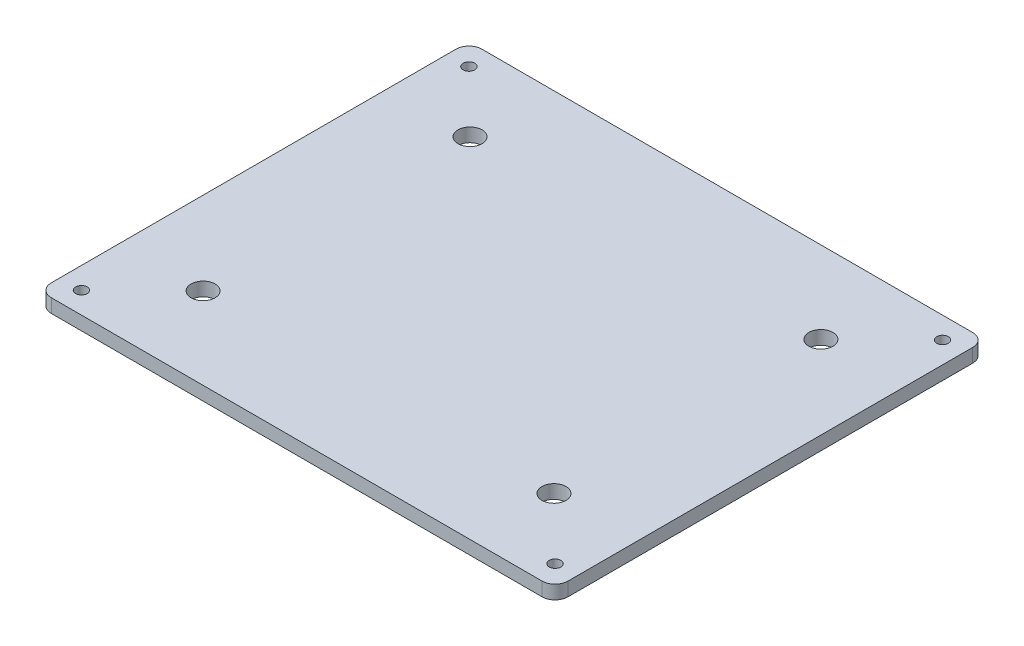
ISO-10303-21;
HEADER;
FILE_DESCRIPTION(('STEP AP214'),'2;1');
FILE_NAME('part.step','',(''),(''),'','','');
FILE_SCHEMA(('AUTOMOTIVE_DESIGN { 1 0 10303 214 1 1 1 1 }'));
ENDSEC;
DATA;
#1=APPLICATION_CONTEXT('core data for automotive mechanical design processes');
#2=APPLICATION_PROTOCOL_DEFINITION('international standard','automotive_design',2000,#1);
#3=PRODUCT_CONTEXT('',#1,'mechanical');
#4=PRODUCT('Part','Part','',(#3));
#5=PRODUCT_RELATED_PRODUCT_CATEGORY('part','',(#4));
#6=PRODUCT_DEFINITION_FORMATION('','',#4);
#7=PRODUCT_DEFINITION_CONTEXT('part definition',#1,'design');
#8=PRODUCT_DEFINITION('design','',#6,#7);
#9=PRODUCT_DEFINITION_SHAPE('','',#8);
#10=(LENGTH_UNIT() NAMED_UNIT(*) SI_UNIT(.MILLI.,.METRE.));
#11=(NAMED_UNIT(*) PLANE_ANGLE_UNIT() SI_UNIT($,.RADIAN.));
#12=(NAMED_UNIT(*) SI_UNIT($,.STERADIAN.) SOLID_ANGLE_UNIT());
#13=UNCERTAINTY_MEASURE_WITH_UNIT(LENGTH_MEASURE(1.E-05),#10,'distance_accuracy_value','');
#14=(GEOMETRIC_REPRESENTATION_CONTEXT(3) GLOBAL_UNCERTAINTY_ASSIGNED_CONTEXT((#13)) GLOBAL_UNIT_ASSIGNED_CONTEXT((#10,
#11,#12)) REPRESENTATION_CONTEXT('',''));
#15=CARTESIAN_POINT('',(0.,0.,0.));
#16=DIRECTION('',(0.,0.,1.));
#17=DIRECTION('',(1.,0.,0.));
#18=AXIS2_PLACEMENT_3D('',#15,#16,#17);
#19=CARTESIAN_POINT('',(-60.,3.175,50.));
#20=DIRECTION('',(1.,0.,0.));
#21=DIRECTION('',(0.,0.,-1.));
#22=AXIS2_PLACEMENT_3D('',#19,#20,#21);
#23=PLANE('',#22);
#24=DIRECTION('',(0.,0.,1.));
#25=VECTOR('',#24,1.);
#26=CARTESIAN_POINT('',(-60.,0.,50.));
#27=LINE('',#26,#25);
#28=CARTESIAN_POINT('',(-60.,0.,-47.));
#29=VERTEX_POINT('',#28);
#30=CARTESIAN_POINT('',(-60.,0.,47.));
#31=VERTEX_POINT('',#30);
#32=EDGE_CURVE('E163',#29,#31,#27,.T.);
#33=ORIENTED_EDGE('',*,*,#32,.T.);
#34=DIRECTION('',(0.,-1.,0.));
#35=VECTOR('',#34,1.);
#36=CARTESIAN_POINT('',(-60.,3.175,47.));
#37=LINE('',#36,#35);
#38=CARTESIAN_POINT('',(-60.,3.175,47.));
#39=VERTEX_POINT('',#38);
#40=EDGE_CURVE('E11',#31,#39,#37,.F.);
#41=ORIENTED_EDGE('',*,*,#40,.T.);
#42=DIRECTION('',(0.,0.,1.));
#43=VECTOR('',#42,1.);
#44=CARTESIAN_POINT('',(-60.,3.175,50.));
#45=LINE('',#44,#43);
#46=CARTESIAN_POINT('',(-60.,3.175,-47.));
#47=VERTEX_POINT('',#46);
#48=EDGE_CURVE('E131',#47,#39,#45,.T.);
#49=ORIENTED_EDGE('',*,*,#48,.F.);
#50=DIRECTION('',(0.,-1.,0.));
#51=VECTOR('',#50,1.);
#52=CARTESIAN_POINT('',(-60.,3.175,-47.));
#53=LINE('',#52,#51);
#54=EDGE_CURVE('E47',#47,#29,#53,.T.);
#55=ORIENTED_EDGE('',*,*,#54,.T.);
#56=EDGE_LOOP('',(#33,#41,#49,#55));
#57=FACE_BOUND('',#56,.T.);
#58=ADVANCED_FACE('F39',(#57),#23,.F.);
#59=CARTESIAN_POINT('',(60.,3.175,50.));
#60=DIRECTION('',(0.,0.,-1.));
#61=DIRECTION('',(-1.,0.,0.));
#62=AXIS2_PLACEMENT_3D('',#59,#60,#61);
#63=PLANE('',#62);
#64=DIRECTION('',(1.,0.,0.));
#65=VECTOR('',#64,1.);
#66=CARTESIAN_POINT('',(60.,0.,50.));
#67=LINE('',#66,#65);
#68=CARTESIAN_POINT('',(-57.,0.,50.));
#69=VERTEX_POINT('',#68);
#70=CARTESIAN_POINT('',(57.,0.,50.));
#71=VERTEX_POINT('',#70);
#72=EDGE_CURVE('E136',#69,#71,#67,.T.);
#73=ORIENTED_EDGE('',*,*,#72,.T.);
#74=DIRECTION('',(0.,-1.,0.));
#75=VECTOR('',#74,1.);
#76=CARTESIAN_POINT('',(57.,3.175,50.));
#77=LINE('',#76,#75);
#78=CARTESIAN_POINT('',(57.,3.175,50.));
#79=VERTEX_POINT('',#78);
#80=EDGE_CURVE('E54',#71,#79,#77,.F.);
#81=ORIENTED_EDGE('',*,*,#80,.T.);
#82=DIRECTION('',(1.,0.,0.));
#83=VECTOR('',#82,1.);
#84=CARTESIAN_POINT('',(60.,3.175,50.));
#85=LINE('',#84,#83);
#86=CARTESIAN_POINT('',(-57.,3.175,50.));
#87=VERTEX_POINT('',#86);
#88=EDGE_CURVE('E134',#87,#79,#85,.T.);
#89=ORIENTED_EDGE('',*,*,#88,.F.);
#90=DIRECTION('',(0.,-1.,0.));
#91=VECTOR('',#90,1.);
#92=CARTESIAN_POINT('',(-57.,3.175,50.));
#93=LINE('',#92,#91);
#94=EDGE_CURVE('E155',#87,#69,#93,.T.);
#95=ORIENTED_EDGE('',*,*,#94,.T.);
#96=EDGE_LOOP('',(#73,#81,#89,#95));
#97=FACE_BOUND('',#96,.T.);
#98=ADVANCED_FACE('F250',(#97),#63,.F.);
#99=CARTESIAN_POINT('',(60.,3.175,50.));
#100=DIRECTION('',(-1.,0.,0.));
#101=DIRECTION('',(0.,0.,1.));
#102=AXIS2_PLACEMENT_3D('',#99,#100,#101);
#103=PLANE('',#102);
#104=DIRECTION('',(0.,0.,-1.));
#105=VECTOR('',#104,1.);
#106=CARTESIAN_POINT('',(60.,0.,50.));
#107=LINE('',#106,#105);
#108=CARTESIAN_POINT('',(60.,0.,47.));
#109=VERTEX_POINT('',#108);
#110=CARTESIAN_POINT('',(60.,0.,-47.));
#111=VERTEX_POINT('',#110);
#112=EDGE_CURVE('E132',#109,#111,#107,.T.);
#113=ORIENTED_EDGE('',*,*,#112,.T.);
#114=DIRECTION('',(0.,-1.,0.));
#115=VECTOR('',#114,1.);
#116=CARTESIAN_POINT('',(60.,3.175,-47.));
#117=LINE('',#116,#115);
#118=CARTESIAN_POINT('',(60.,3.175,-47.));
#119=VERTEX_POINT('',#118);
#120=EDGE_CURVE('E110',#111,#119,#117,.F.);
#121=ORIENTED_EDGE('',*,*,#120,.T.);
#122=DIRECTION('',(0.,0.,-1.));
#123=VECTOR('',#122,1.);
#124=CARTESIAN_POINT('',(60.,3.175,50.));
#125=LINE('',#124,#123);
#126=CARTESIAN_POINT('',(60.,3.175,47.));
#127=VERTEX_POINT('',#126);
#128=EDGE_CURVE('E175',#127,#119,#125,.T.);
#129=ORIENTED_EDGE('',*,*,#128,.F.);
#130=DIRECTION('',(0.,-1.,0.));
#131=VECTOR('',#130,1.);
#132=CARTESIAN_POINT('',(60.,3.175,47.));
#133=LINE('',#132,#131);
#134=EDGE_CURVE('E115',#127,#109,#133,.T.);
#135=ORIENTED_EDGE('',*,*,#134,.T.);
#136=EDGE_LOOP('',(#113,#121,#129,#135));
#137=FACE_BOUND('',#136,.T.);
#138=ADVANCED_FACE('F247',(#137),#103,.F.);
#139=CARTESIAN_POINT('',(60.,3.175,-50.));
#140=DIRECTION('',(0.,0.,1.));
#141=DIRECTION('',(1.,0.,0.));
#142=AXIS2_PLACEMENT_3D('',#139,#140,#141);
#143=PLANE('',#142);
#144=DIRECTION('',(-1.,0.,0.));
#145=VECTOR('',#144,1.);
#146=CARTESIAN_POINT('',(60.,3.175,-50.));
#147=LINE('',#146,#145);
#148=CARTESIAN_POINT('',(57.,3.175,-50.));
#149=VERTEX_POINT('',#148);
#150=CARTESIAN_POINT('',(-57.,3.175,-50.));
#151=VERTEX_POINT('',#150);
#152=EDGE_CURVE('E125',#149,#151,#147,.T.);
#153=ORIENTED_EDGE('',*,*,#152,.F.);
#154=DIRECTION('',(0.,-1.,0.));
#155=VECTOR('',#154,1.);
#156=CARTESIAN_POINT('',(57.,3.175,-50.));
#157=LINE('',#156,#155);
#158=CARTESIAN_POINT('',(57.,0.,-50.));
#159=VERTEX_POINT('',#158);
#160=EDGE_CURVE('E109',#149,#159,#157,.T.);
#161=ORIENTED_EDGE('',*,*,#160,.T.);
#162=DIRECTION('',(-1.,0.,0.));
#163=VECTOR('',#162,1.);
#164=CARTESIAN_POINT('',(60.,0.,-50.));
#165=LINE('',#164,#163);
#166=CARTESIAN_POINT('',(-57.,0.,-50.));
#167=VERTEX_POINT('',#166);
#168=EDGE_CURVE('E122',#159,#167,#165,.T.);
#169=ORIENTED_EDGE('',*,*,#168,.T.);
#170=DIRECTION('',(0.,-1.,0.));
#171=VECTOR('',#170,1.);
#172=CARTESIAN_POINT('',(-57.,3.175,-50.));
#173=LINE('',#172,#171);
#174=EDGE_CURVE('E127',#167,#151,#173,.F.);
#175=ORIENTED_EDGE('',*,*,#174,.T.);
#176=EDGE_LOOP('',(#153,#161,#169,#175));
#177=FACE_BOUND('',#176,.T.);
#178=ADVANCED_FACE('F121',(#177),#143,.F.);
#179=CARTESIAN_POINT('',(0.,3.175,0.));
#180=DIRECTION('',(0.,1.,0.));
#181=DIRECTION('',(0.,0.,1.));
#182=AXIS2_PLACEMENT_3D('',#179,#180,#181);
#183=PLANE('',#182);
#184=CARTESIAN_POINT('',(-55.,3.175,-45.));
#185=DIRECTION('',(0.,1.,0.));
#186=DIRECTION('',(0.,0.,1.));
#187=AXIS2_PLACEMENT_3D('',#184,#185,#186);
#188=CIRCLE('',#187,1.35);
#189=CARTESIAN_POINT('',(-55.,3.175,-43.65));
#190=VERTEX_POINT('',#189);
#191=EDGE_CURVE('E220',#190,#190,#188,.T.);
#192=ORIENTED_EDGE('',*,*,#191,.F.);
#193=EDGE_LOOP('',(#192));
#194=FACE_BOUND('',#193,.T.);
#195=CARTESIAN_POINT('',(55.,3.175,-45.));
#196=DIRECTION('',(0.,1.,0.));
#197=DIRECTION('',(0.,0.,1.));
#198=AXIS2_PLACEMENT_3D('',#195,#196,#197);
#199=CIRCLE('',#198,1.35);
#200=CARTESIAN_POINT('',(55.,3.175,-43.65));
#201=VERTEX_POINT('',#200);
#202=EDGE_CURVE('E214',#201,#201,#199,.T.);
#203=ORIENTED_EDGE('',*,*,#202,.F.);
#204=EDGE_LOOP('',(#203));
#205=FACE_BOUND('',#204,.T.);
#206=CARTESIAN_POINT('',(-55.,3.175,45.));
#207=DIRECTION('',(0.,1.,0.));
#208=DIRECTION('',(0.,0.,1.));
#209=AXIS2_PLACEMENT_3D('',#206,#207,#208);
#210=CIRCLE('',#209,1.35);
#211=CARTESIAN_POINT('',(-55.,3.175,46.35));
#212=VERTEX_POINT('',#211);
#213=EDGE_CURVE('E208',#212,#212,#210,.T.);
#214=ORIENTED_EDGE('',*,*,#213,.F.);
#215=EDGE_LOOP('',(#214));
#216=FACE_BOUND('',#215,.T.);
#217=CARTESIAN_POINT('',(55.,3.175,45.));
#218=DIRECTION('',(0.,1.,0.));
#219=DIRECTION('',(0.,0.,1.));
#220=AXIS2_PLACEMENT_3D('',#217,#218,#219);
#221=CIRCLE('',#220,1.35);
#222=CARTESIAN_POINT('',(55.,3.175,46.35));
#223=VERTEX_POINT('',#222);
#224=EDGE_CURVE('E202',#223,#223,#221,.T.);
#225=ORIENTED_EDGE('',*,*,#224,.F.);
#226=EDGE_LOOP('',(#225));
#227=FACE_BOUND('',#226,.T.);
#228=CARTESIAN_POINT('',(40.75,3.175,-31.));
#229=DIRECTION('',(0.,1.,0.));
#230=DIRECTION('',(0.,0.,1.));
#231=AXIS2_PLACEMENT_3D('',#228,#229,#230);
#232=CIRCLE('',#231,2.794);
#233=CARTESIAN_POINT('',(40.75,3.175,-28.206));
#234=VERTEX_POINT('',#233);
#235=EDGE_CURVE('E185',#234,#234,#232,.T.);
#236=ORIENTED_EDGE('',*,*,#235,.F.);
#237=EDGE_LOOP('',(#236));
#238=FACE_BOUND('',#237,.T.);
#239=CARTESIAN_POINT('',(40.75,3.175,31.));
#240=DIRECTION('',(0.,1.,0.));
#241=DIRECTION('',(0.,0.,1.));
#242=AXIS2_PLACEMENT_3D('',#239,#240,#241);
#243=CIRCLE('',#242,2.794);
#244=CARTESIAN_POINT('',(40.75,3.175,33.794));
#245=VERTEX_POINT('',#244);
#246=EDGE_CURVE('E192',#245,#245,#243,.T.);
#247=ORIENTED_EDGE('',*,*,#246,.F.);
#248=EDGE_LOOP('',(#247));
#249=FACE_BOUND('',#248,.T.);
#250=CARTESIAN_POINT('',(-40.75,3.175,31.));
#251=DIRECTION('',(0.,1.,0.));
#252=DIRECTION('',(0.,0.,1.));
#253=AXIS2_PLACEMENT_3D('',#250,#251,#252);
#254=CIRCLE('',#253,2.794);
#255=CARTESIAN_POINT('',(-40.75,3.175,33.794));
#256=VERTEX_POINT('',#255);
#257=EDGE_CURVE('E180',#256,#256,#254,.T.);
#258=ORIENTED_EDGE('',*,*,#257,.F.);
#259=EDGE_LOOP('',(#258));
#260=FACE_BOUND('',#259,.T.);
#261=CARTESIAN_POINT('',(-40.75,3.175,-31.));
#262=DIRECTION('',(0.,1.,0.));
#263=DIRECTION('',(0.,0.,1.));
#264=AXIS2_PLACEMENT_3D('',#261,#262,#263);
#265=CIRCLE('',#264,2.794);
#266=CARTESIAN_POINT('',(-40.75,3.175,-28.206));
#267=VERTEX_POINT('',#266);
#268=EDGE_CURVE('E171',#267,#267,#265,.T.);
#269=ORIENTED_EDGE('',*,*,#268,.F.);
#270=EDGE_LOOP('',(#269));
#271=FACE_BOUND('',#270,.T.);
#272=ORIENTED_EDGE('',*,*,#128,.T.);
#273=CARTESIAN_POINT('',(57.,3.175,-47.));
#274=DIRECTION('',(0.,1.,0.));
#275=DIRECTION('',(0.,0.,1.));
#276=AXIS2_PLACEMENT_3D('',#273,#274,#275);
#277=CIRCLE('',#276,3.);
#278=EDGE_CURVE('E153',#119,#149,#277,.T.);
#279=ORIENTED_EDGE('',*,*,#278,.T.);
#280=ORIENTED_EDGE('',*,*,#152,.T.);
#281=CARTESIAN_POINT('',(-57.,3.175,-47.));
#282=DIRECTION('',(0.,1.,0.));
#283=DIRECTION('',(0.,0.,1.));
#284=AXIS2_PLACEMENT_3D('',#281,#282,#283);
#285=CIRCLE('',#284,3.);
#286=EDGE_CURVE('E148',#151,#47,#285,.T.);
#287=ORIENTED_EDGE('',*,*,#286,.T.);
#288=ORIENTED_EDGE('',*,*,#48,.T.);
#289=CARTESIAN_POINT('',(-57.,3.175,47.));
#290=DIRECTION('',(0.,1.,0.));
#291=DIRECTION('',(0.,0.,1.));
#292=AXIS2_PLACEMENT_3D('',#289,#290,#291);
#293=CIRCLE('',#292,3.);
#294=EDGE_CURVE('E61',#39,#87,#293,.T.);
#295=ORIENTED_EDGE('',*,*,#294,.T.);
#296=ORIENTED_EDGE('',*,*,#88,.T.);
#297=CARTESIAN_POINT('',(57.,3.175,47.));
#298=DIRECTION('',(0.,1.,0.));
#299=DIRECTION('',(0.,0.,1.));
#300=AXIS2_PLACEMENT_3D('',#297,#298,#299);
#301=CIRCLE('',#300,3.);
#302=EDGE_CURVE('E151',#79,#127,#301,.T.);
#303=ORIENTED_EDGE('',*,*,#302,.T.);
#304=EDGE_LOOP('',(#272,#279,#280,#287,#288,#295,#296,#303));
#305=FACE_BOUND('',#304,.T.);
#306=ADVANCED_FACE('F226',(#194,#205,#216,#227,#238,#249,#260,#271,#305),#183,.T.);
#307=CARTESIAN_POINT('',(0.,0.,0.));
#308=DIRECTION('',(0.,1.,0.));
#309=DIRECTION('',(0.,0.,1.));
#310=AXIS2_PLACEMENT_3D('',#307,#308,#309);
#311=PLANE('',#310);
#312=CARTESIAN_POINT('',(-55.,0.,-45.));
#313=DIRECTION('',(0.,1.,0.));
#314=DIRECTION('',(0.,0.,1.));
#315=AXIS2_PLACEMENT_3D('',#312,#313,#314);
#316=CIRCLE('',#315,1.35);
#317=CARTESIAN_POINT('',(-55.,0.,-43.65));
#318=VERTEX_POINT('',#317);
#319=EDGE_CURVE('E217',#318,#318,#316,.T.);
#320=ORIENTED_EDGE('',*,*,#319,.T.);
#321=EDGE_LOOP('',(#320));
#322=FACE_BOUND('',#321,.T.);
#323=CARTESIAN_POINT('',(55.,0.,-45.));
#324=DIRECTION('',(0.,1.,0.));
#325=DIRECTION('',(0.,0.,1.));
#326=AXIS2_PLACEMENT_3D('',#323,#324,#325);
#327=CIRCLE('',#326,1.35);
#328=CARTESIAN_POINT('',(55.,0.,-43.65));
#329=VERTEX_POINT('',#328);
#330=EDGE_CURVE('E211',#329,#329,#327,.T.);
#331=ORIENTED_EDGE('',*,*,#330,.T.);
#332=EDGE_LOOP('',(#331));
#333=FACE_BOUND('',#332,.T.);
#334=CARTESIAN_POINT('',(-55.,0.,45.));
#335=DIRECTION('',(0.,1.,0.));
#336=DIRECTION('',(0.,0.,1.));
#337=AXIS2_PLACEMENT_3D('',#334,#335,#336);
#338=CIRCLE('',#337,1.35);
#339=CARTESIAN_POINT('',(-55.,0.,46.35));
#340=VERTEX_POINT('',#339);
#341=EDGE_CURVE('E205',#340,#340,#338,.T.);
#342=ORIENTED_EDGE('',*,*,#341,.T.);
#343=EDGE_LOOP('',(#342));
#344=FACE_BOUND('',#343,.T.);
#345=CARTESIAN_POINT('',(55.,0.,45.));
#346=DIRECTION('',(0.,1.,0.));
#347=DIRECTION('',(0.,0.,1.));
#348=AXIS2_PLACEMENT_3D('',#345,#346,#347);
#349=CIRCLE('',#348,1.35);
#350=CARTESIAN_POINT('',(55.,0.,46.35));
#351=VERTEX_POINT('',#350);
#352=EDGE_CURVE('E186',#351,#351,#349,.T.);
#353=ORIENTED_EDGE('',*,*,#352,.T.);
#354=EDGE_LOOP('',(#353));
#355=FACE_BOUND('',#354,.T.);
#356=CARTESIAN_POINT('',(40.75,0.,-31.));
#357=DIRECTION('',(0.,1.,0.));
#358=DIRECTION('',(0.,0.,1.));
#359=AXIS2_PLACEMENT_3D('',#356,#357,#358);
#360=CIRCLE('',#359,2.794);
#361=CARTESIAN_POINT('',(40.75,0.,-28.206));
#362=VERTEX_POINT('',#361);
#363=EDGE_CURVE('E182',#362,#362,#360,.T.);
#364=ORIENTED_EDGE('',*,*,#363,.T.);
#365=EDGE_LOOP('',(#364));
#366=FACE_BOUND('',#365,.T.);
#367=CARTESIAN_POINT('',(40.75,0.,31.));
#368=DIRECTION('',(0.,1.,0.));
#369=DIRECTION('',(0.,0.,1.));
#370=AXIS2_PLACEMENT_3D('',#367,#368,#369);
#371=CIRCLE('',#370,2.794);
#372=CARTESIAN_POINT('',(40.75,0.,33.794));
#373=VERTEX_POINT('',#372);
#374=EDGE_CURVE('E189',#373,#373,#371,.T.);
#375=ORIENTED_EDGE('',*,*,#374,.T.);
#376=EDGE_LOOP('',(#375));
#377=FACE_BOUND('',#376,.T.);
#378=CARTESIAN_POINT('',(-40.75,0.,31.));
#379=DIRECTION('',(0.,1.,0.));
#380=DIRECTION('',(0.,0.,1.));
#381=AXIS2_PLACEMENT_3D('',#378,#379,#380);
#382=CIRCLE('',#381,2.794);
#383=CARTESIAN_POINT('',(-40.75,0.,33.794));
#384=VERTEX_POINT('',#383);
#385=EDGE_CURVE('E195',#384,#384,#382,.T.);
#386=ORIENTED_EDGE('',*,*,#385,.T.);
#387=EDGE_LOOP('',(#386));
#388=FACE_BOUND('',#387,.T.);
#389=CARTESIAN_POINT('',(-40.75,0.,-31.));
#390=DIRECTION('',(0.,1.,0.));
#391=DIRECTION('',(0.,0.,1.));
#392=AXIS2_PLACEMENT_3D('',#389,#390,#391);
#393=CIRCLE('',#392,2.794);
#394=CARTESIAN_POINT('',(-40.75,0.,-28.206));
#395=VERTEX_POINT('',#394);
#396=EDGE_CURVE('E168',#395,#395,#393,.T.);
#397=ORIENTED_EDGE('',*,*,#396,.T.);
#398=EDGE_LOOP('',(#397));
#399=FACE_BOUND('',#398,.T.);
#400=ORIENTED_EDGE('',*,*,#168,.F.);
#401=CARTESIAN_POINT('',(57.,0.,-47.));
#402=DIRECTION('',(0.,1.,0.));
#403=DIRECTION('',(0.,0.,1.));
#404=AXIS2_PLACEMENT_3D('',#401,#402,#403);
#405=CIRCLE('',#404,3.);
#406=EDGE_CURVE('E105',#159,#111,#405,.F.);
#407=ORIENTED_EDGE('',*,*,#406,.T.);
#408=ORIENTED_EDGE('',*,*,#112,.F.);
#409=CARTESIAN_POINT('',(57.,0.,47.));
#410=DIRECTION('',(0.,1.,0.));
#411=DIRECTION('',(0.,0.,1.));
#412=AXIS2_PLACEMENT_3D('',#409,#410,#411);
#413=CIRCLE('',#412,3.);
#414=EDGE_CURVE('E116',#109,#71,#413,.F.);
#415=ORIENTED_EDGE('',*,*,#414,.T.);
#416=ORIENTED_EDGE('',*,*,#72,.F.);
#417=CARTESIAN_POINT('',(-57.,0.,47.));
#418=DIRECTION('',(0.,1.,0.));
#419=DIRECTION('',(0.,0.,1.));
#420=AXIS2_PLACEMENT_3D('',#417,#418,#419);
#421=CIRCLE('',#420,3.);
#422=EDGE_CURVE('E142',#69,#31,#421,.F.);
#423=ORIENTED_EDGE('',*,*,#422,.T.);
#424=ORIENTED_EDGE('',*,*,#32,.F.);
#425=CARTESIAN_POINT('',(-57.,0.,-47.));
#426=DIRECTION('',(0.,1.,0.));
#427=DIRECTION('',(0.,0.,1.));
#428=AXIS2_PLACEMENT_3D('',#425,#426,#427);
#429=CIRCLE('',#428,3.);
#430=EDGE_CURVE('E126',#29,#167,#429,.F.);
#431=ORIENTED_EDGE('',*,*,#430,.T.);
#432=EDGE_LOOP('',(#400,#407,#408,#415,#416,#423,#424,#431));
#433=FACE_BOUND('',#432,.T.);
#434=ADVANCED_FACE('F129',(#322,#333,#344,#355,#366,#377,#388,#399,#433),#311,.F.);
#435=CARTESIAN_POINT('',(-40.75,0.,-31.));
#436=DIRECTION('',(0.,1.,0.));
#437=DIRECTION('',(0.,0.,1.));
#438=AXIS2_PLACEMENT_3D('',#435,#436,#437);
#439=CYLINDRICAL_SURFACE('',#438,2.794);
#440=ORIENTED_EDGE('',*,*,#396,.F.);
#441=EDGE_LOOP('',(#440));
#442=FACE_BOUND('',#441,.T.);
#443=ORIENTED_EDGE('',*,*,#268,.T.);
#444=EDGE_LOOP('',(#443));
#445=FACE_BOUND('',#444,.T.);
#446=ADVANCED_FACE('F351',(#442,#445),#439,.F.);
#447=CARTESIAN_POINT('',(-40.75,0.,31.));
#448=DIRECTION('',(0.,1.,0.));
#449=DIRECTION('',(0.,0.,1.));
#450=AXIS2_PLACEMENT_3D('',#447,#448,#449);
#451=CYLINDRICAL_SURFACE('',#450,2.794);
#452=ORIENTED_EDGE('',*,*,#385,.F.);
#453=EDGE_LOOP('',(#452));
#454=FACE_BOUND('',#453,.T.);
#455=ORIENTED_EDGE('',*,*,#257,.T.);
#456=EDGE_LOOP('',(#455));
#457=FACE_BOUND('',#456,.T.);
#458=ADVANCED_FACE('F342',(#454,#457),#451,.F.);
#459=CARTESIAN_POINT('',(40.75,0.,31.));
#460=DIRECTION('',(0.,1.,0.));
#461=DIRECTION('',(0.,0.,1.));
#462=AXIS2_PLACEMENT_3D('',#459,#460,#461);
#463=CYLINDRICAL_SURFACE('',#462,2.794);
#464=ORIENTED_EDGE('',*,*,#374,.F.);
#465=EDGE_LOOP('',(#464));
#466=FACE_BOUND('',#465,.T.);
#467=ORIENTED_EDGE('',*,*,#246,.T.);
#468=EDGE_LOOP('',(#467));
#469=FACE_BOUND('',#468,.T.);
#470=ADVANCED_FACE('F333',(#466,#469),#463,.F.);
#471=CARTESIAN_POINT('',(40.75,0.,-31.));
#472=DIRECTION('',(0.,1.,0.));
#473=DIRECTION('',(0.,0.,1.));
#474=AXIS2_PLACEMENT_3D('',#471,#472,#473);
#475=CYLINDRICAL_SURFACE('',#474,2.794);
#476=ORIENTED_EDGE('',*,*,#363,.F.);
#477=EDGE_LOOP('',(#476));
#478=FACE_BOUND('',#477,.T.);
#479=ORIENTED_EDGE('',*,*,#235,.T.);
#480=EDGE_LOOP('',(#479));
#481=FACE_BOUND('',#480,.T.);
#482=ADVANCED_FACE('F324',(#478,#481),#475,.F.);
#483=CARTESIAN_POINT('',(55.,3.175,45.));
#484=DIRECTION('',(0.,1.,0.));
#485=DIRECTION('',(0.,0.,1.));
#486=AXIS2_PLACEMENT_3D('',#483,#484,#485);
#487=CYLINDRICAL_SURFACE('',#486,1.35);
#488=ORIENTED_EDGE('',*,*,#352,.F.);
#489=EDGE_LOOP('',(#488));
#490=FACE_BOUND('',#489,.T.);
#491=ORIENTED_EDGE('',*,*,#224,.T.);
#492=EDGE_LOOP('',(#491));
#493=FACE_BOUND('',#492,.T.);
#494=ADVANCED_FACE('F315',(#490,#493),#487,.F.);
#495=CARTESIAN_POINT('',(-55.,3.175,45.));
#496=DIRECTION('',(0.,1.,0.));
#497=DIRECTION('',(0.,0.,1.));
#498=AXIS2_PLACEMENT_3D('',#495,#496,#497);
#499=CYLINDRICAL_SURFACE('',#498,1.35);
#500=ORIENTED_EDGE('',*,*,#341,.F.);
#501=EDGE_LOOP('',(#500));
#502=FACE_BOUND('',#501,.T.);
#503=ORIENTED_EDGE('',*,*,#213,.T.);
#504=EDGE_LOOP('',(#503));
#505=FACE_BOUND('',#504,.T.);
#506=ADVANCED_FACE('F306',(#502,#505),#499,.F.);
#507=CARTESIAN_POINT('',(55.,3.175,-45.));
#508=DIRECTION('',(0.,1.,0.));
#509=DIRECTION('',(0.,0.,1.));
#510=AXIS2_PLACEMENT_3D('',#507,#508,#509);
#511=CYLINDRICAL_SURFACE('',#510,1.35);
#512=ORIENTED_EDGE('',*,*,#330,.F.);
#513=EDGE_LOOP('',(#512));
#514=FACE_BOUND('',#513,.T.);
#515=ORIENTED_EDGE('',*,*,#202,.T.);
#516=EDGE_LOOP('',(#515));
#517=FACE_BOUND('',#516,.T.);
#518=ADVANCED_FACE('F297',(#514,#517),#511,.F.);
#519=CARTESIAN_POINT('',(-55.,3.175,-45.));
#520=DIRECTION('',(0.,1.,0.));
#521=DIRECTION('',(0.,0.,1.));
#522=AXIS2_PLACEMENT_3D('',#519,#520,#521);
#523=CYLINDRICAL_SURFACE('',#522,1.35);
#524=ORIENTED_EDGE('',*,*,#319,.F.);
#525=EDGE_LOOP('',(#524));
#526=FACE_BOUND('',#525,.T.);
#527=ORIENTED_EDGE('',*,*,#191,.T.);
#528=EDGE_LOOP('',(#527));
#529=FACE_BOUND('',#528,.T.);
#530=ADVANCED_FACE('F224',(#526,#529),#523,.F.);
#531=CARTESIAN_POINT('',(57.,3.175,-47.));
#532=DIRECTION('',(0.,-1.,0.));
#533=DIRECTION('',(0.,0.,-1.));
#534=AXIS2_PLACEMENT_3D('',#531,#532,#533);
#535=CYLINDRICAL_SURFACE('',#534,3.);
#536=ORIENTED_EDGE('',*,*,#278,.F.);
#537=ORIENTED_EDGE('',*,*,#120,.F.);
#538=ORIENTED_EDGE('',*,*,#406,.F.);
#539=ORIENTED_EDGE('',*,*,#160,.F.);
#540=EDGE_LOOP('',(#536,#537,#538,#539));
#541=FACE_BOUND('',#540,.T.);
#542=ADVANCED_FACE('F108',(#541),#535,.T.);
#543=CARTESIAN_POINT('',(57.,3.175,47.));
#544=DIRECTION('',(0.,-1.,0.));
#545=DIRECTION('',(0.,0.,-1.));
#546=AXIS2_PLACEMENT_3D('',#543,#544,#545);
#547=CYLINDRICAL_SURFACE('',#546,3.);
#548=ORIENTED_EDGE('',*,*,#302,.F.);
#549=ORIENTED_EDGE('',*,*,#80,.F.);
#550=ORIENTED_EDGE('',*,*,#414,.F.);
#551=ORIENTED_EDGE('',*,*,#134,.F.);
#552=EDGE_LOOP('',(#548,#549,#550,#551));
#553=FACE_BOUND('',#552,.T.);
#554=ADVANCED_FACE('F249',(#553),#547,.T.);
#555=CARTESIAN_POINT('',(-57.,3.175,47.));
#556=DIRECTION('',(0.,-1.,0.));
#557=DIRECTION('',(0.,0.,-1.));
#558=AXIS2_PLACEMENT_3D('',#555,#556,#557);
#559=CYLINDRICAL_SURFACE('',#558,3.);
#560=ORIENTED_EDGE('',*,*,#294,.F.);
#561=ORIENTED_EDGE('',*,*,#40,.F.);
#562=ORIENTED_EDGE('',*,*,#422,.F.);
#563=ORIENTED_EDGE('',*,*,#94,.F.);
#564=EDGE_LOOP('',(#560,#561,#562,#563));
#565=FACE_BOUND('',#564,.T.);
#566=ADVANCED_FACE('F253',(#565),#559,.T.);
#567=CARTESIAN_POINT('',(-57.,3.175,-47.));
#568=DIRECTION('',(0.,-1.,0.));
#569=DIRECTION('',(0.,0.,-1.));
#570=AXIS2_PLACEMENT_3D('',#567,#568,#569);
#571=CYLINDRICAL_SURFACE('',#570,3.);
#572=ORIENTED_EDGE('',*,*,#286,.F.);
#573=ORIENTED_EDGE('',*,*,#174,.F.);
#574=ORIENTED_EDGE('',*,*,#430,.F.);
#575=ORIENTED_EDGE('',*,*,#54,.F.);
#576=EDGE_LOOP('',(#572,#573,#574,#575));
#577=FACE_BOUND('',#576,.T.);
#578=ADVANCED_FACE('F41',(#577),#571,.T.);
#579=CLOSED_SHELL('',(#58,#98,#138,#178,#306,#434,#446,#458,#470,#482,#494,#506,#518,#530,#542,
#554,#566,#578));
#580=MANIFOLD_SOLID_BREP('B2',#579);
#581=ADVANCED_BREP_SHAPE_REPRESENTATION('',(#18,#580),#14);
#582=SHAPE_DEFINITION_REPRESENTATION(#9,#581);
ENDSEC;
END-ISO-10303-21;
